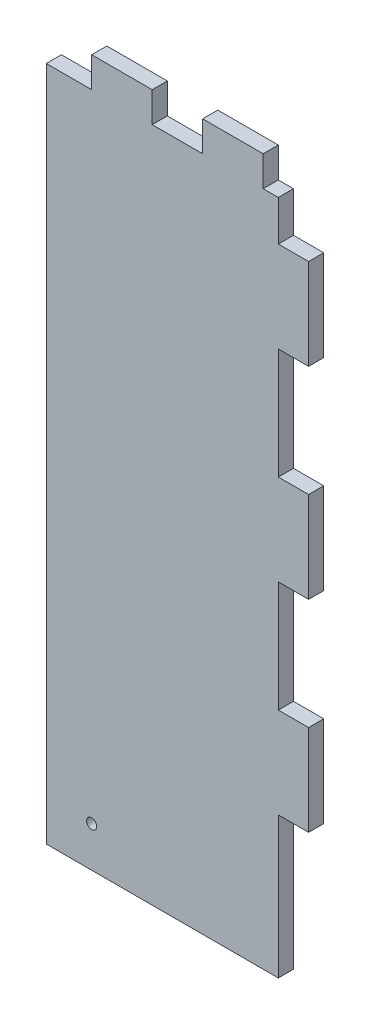
ISO-10303-21;
HEADER;
FILE_DESCRIPTION(('STEP AP214'),'2;1');
FILE_NAME('part.step','',(''),(''),'','','');
FILE_SCHEMA(('AUTOMOTIVE_DESIGN { 1 0 10303 214 1 1 1 1 }'));
ENDSEC;
DATA;
#1=APPLICATION_CONTEXT('core data for automotive mechanical design processes');
#2=APPLICATION_PROTOCOL_DEFINITION('international standard','automotive_design',2000,#1);
#3=PRODUCT_CONTEXT('',#1,'mechanical');
#4=PRODUCT('Part','Part','',(#3));
#5=PRODUCT_RELATED_PRODUCT_CATEGORY('part','',(#4));
#6=PRODUCT_DEFINITION_FORMATION('','',#4);
#7=PRODUCT_DEFINITION_CONTEXT('part definition',#1,'design');
#8=PRODUCT_DEFINITION('design','',#6,#7);
#9=PRODUCT_DEFINITION_SHAPE('','',#8);
#10=(LENGTH_UNIT() NAMED_UNIT(*) SI_UNIT(.MILLI.,.METRE.));
#11=(NAMED_UNIT(*) PLANE_ANGLE_UNIT() SI_UNIT($,.RADIAN.));
#12=(NAMED_UNIT(*) SI_UNIT($,.STERADIAN.) SOLID_ANGLE_UNIT());
#13=UNCERTAINTY_MEASURE_WITH_UNIT(LENGTH_MEASURE(1.E-05),#10,'distance_accuracy_value','');
#14=(GEOMETRIC_REPRESENTATION_CONTEXT(3) GLOBAL_UNCERTAINTY_ASSIGNED_CONTEXT((#13)) GLOBAL_UNIT_ASSIGNED_CONTEXT((#10,
#11,#12)) REPRESENTATION_CONTEXT('',''));
#15=CARTESIAN_POINT('',(0.,0.,0.));
#16=DIRECTION('',(0.,0.,1.));
#17=DIRECTION('',(1.,0.,0.));
#18=AXIS2_PLACEMENT_3D('',#15,#16,#17);
#19=CARTESIAN_POINT('',(46.7532467532468,-43.1168831168831,3.));
#20=DIRECTION('',(-1.,0.,0.));
#21=DIRECTION('',(0.,0.,1.));
#22=AXIS2_PLACEMENT_3D('',#19,#20,#21);
#23=PLANE('',#22);
#24=DIRECTION('',(0.,1.,0.));
#25=VECTOR('',#24,1.);
#26=CARTESIAN_POINT('',(46.7532467532468,-43.1168831168831,0.));
#27=LINE('',#26,#25);
#28=CARTESIAN_POINT('',(46.7532467532468,24.883116599044,0.));
#29=VERTEX_POINT('',#28);
#30=CARTESIAN_POINT('',(46.7532467532468,42.883116599044,0.));
#31=VERTEX_POINT('',#30);
#32=EDGE_CURVE('E378',#29,#31,#27,.T.);
#33=ORIENTED_EDGE('',*,*,#32,.T.);
#34=DIRECTION('',(0.,0.,1.));
#35=VECTOR('',#34,1.);
#36=CARTESIAN_POINT('',(46.7532467532468,42.883116599044,0.));
#37=LINE('',#36,#35);
#38=CARTESIAN_POINT('',(46.7532467532468,42.883116599044,3.));
#39=VERTEX_POINT('',#38);
#40=EDGE_CURVE('E250',#31,#39,#37,.T.);
#41=ORIENTED_EDGE('',*,*,#40,.T.);
#42=DIRECTION('',(0.,1.,0.));
#43=VECTOR('',#42,1.);
#44=CARTESIAN_POINT('',(46.7532467532468,-43.1168831168831,3.));
#45=LINE('',#44,#43);
#46=CARTESIAN_POINT('',(46.7532467532468,24.883116599044,3.));
#47=VERTEX_POINT('',#46);
#48=EDGE_CURVE('E368',#47,#39,#45,.T.);
#49=ORIENTED_EDGE('',*,*,#48,.F.);
#50=DIRECTION('',(0.,0.,1.));
#51=VECTOR('',#50,1.);
#52=CARTESIAN_POINT('',(46.7532467532468,24.883116599044,0.));
#53=LINE('',#52,#51);
#54=EDGE_CURVE('E302',#29,#47,#53,.T.);
#55=ORIENTED_EDGE('',*,*,#54,.F.);
#56=EDGE_LOOP('',(#33,#41,#49,#55));
#57=FACE_BOUND('',#56,.T.);
#58=ADVANCED_FACE('F35',(#57),#23,.F.);
#59=CARTESIAN_POINT('',(46.7532467532468,-15.116883400956,0.));
#60=VERTEX_POINT('',#59);
#61=CARTESIAN_POINT('',(46.7532467532468,2.88311659904397,0.));
#62=VERTEX_POINT('',#61);
#63=EDGE_CURVE('E379',#60,#62,#27,.T.);
#64=ORIENTED_EDGE('',*,*,#63,.T.);
#65=DIRECTION('',(0.,0.,1.));
#66=VECTOR('',#65,1.);
#67=CARTESIAN_POINT('',(46.7532467532468,2.88311659904397,0.));
#68=LINE('',#67,#66);
#69=CARTESIAN_POINT('',(46.7532467532468,2.88311659904397,3.));
#70=VERTEX_POINT('',#69);
#71=EDGE_CURVE('E281',#62,#70,#68,.T.);
#72=ORIENTED_EDGE('',*,*,#71,.T.);
#73=CARTESIAN_POINT('',(46.7532467532468,-15.116883400956,3.));
#74=VERTEX_POINT('',#73);
#75=EDGE_CURVE('E369',#74,#70,#45,.T.);
#76=ORIENTED_EDGE('',*,*,#75,.F.);
#77=DIRECTION('',(0.,0.,1.));
#78=VECTOR('',#77,1.);
#79=CARTESIAN_POINT('',(46.7532467532468,-15.116883400956,0.));
#80=LINE('',#79,#78);
#81=EDGE_CURVE('E325',#60,#74,#80,.T.);
#82=ORIENTED_EDGE('',*,*,#81,.F.);
#83=EDGE_LOOP('',(#64,#72,#76,#82));
#84=FACE_BOUND('',#83,.T.);
#85=ADVANCED_FACE('F408',(#84),#23,.F.);
#86=CARTESIAN_POINT('',(-5.24675324675319,96.8831168831169,3.));
#87=DIRECTION('',(0.,-1.,0.));
#88=DIRECTION('',(0.,0.,-1.));
#89=AXIS2_PLACEMENT_3D('',#86,#87,#88);
#90=PLANE('',#89);
#91=DIRECTION('',(-1.,0.,0.));
#92=VECTOR('',#91,1.);
#93=CARTESIAN_POINT('',(-5.24675324675319,96.8831168831169,3.));
#94=LINE('',#93,#92);
#95=CARTESIAN_POINT('',(15.7532467532466,96.8831168831169,3.));
#96=VERTEX_POINT('',#95);
#97=CARTESIAN_POINT('',(3.75324675324659,96.8831168831169,3.));
#98=VERTEX_POINT('',#97);
#99=EDGE_CURVE('E370',#96,#98,#94,.T.);
#100=ORIENTED_EDGE('',*,*,#99,.F.);
#101=DIRECTION('',(0.,0.,1.));
#102=VECTOR('',#101,1.);
#103=CARTESIAN_POINT('',(15.7532467532466,96.8831168831169,0.));
#104=LINE('',#103,#102);
#105=CARTESIAN_POINT('',(15.7532467532466,96.8831168831169,0.));
#106=VERTEX_POINT('',#105);
#107=EDGE_CURVE('E227',#106,#96,#104,.T.);
#108=ORIENTED_EDGE('',*,*,#107,.F.);
#109=DIRECTION('',(-1.,0.,0.));
#110=VECTOR('',#109,1.);
#111=CARTESIAN_POINT('',(-5.24675324675319,96.8831168831169,0.));
#112=LINE('',#111,#110);
#113=CARTESIAN_POINT('',(3.75324675324659,96.8831168831169,0.));
#114=VERTEX_POINT('',#113);
#115=EDGE_CURVE('E217',#106,#114,#112,.T.);
#116=ORIENTED_EDGE('',*,*,#115,.T.);
#117=DIRECTION('',(0.,0.,1.));
#118=VECTOR('',#117,1.);
#119=CARTESIAN_POINT('',(3.75324675324659,96.8831168831169,0.));
#120=LINE('',#119,#118);
#121=EDGE_CURVE('E352',#114,#98,#120,.T.);
#122=ORIENTED_EDGE('',*,*,#121,.T.);
#123=EDGE_LOOP('',(#100,#108,#116,#122));
#124=FACE_BOUND('',#123,.T.);
#125=ADVANCED_FACE('F433',(#124),#90,.F.);
#126=CARTESIAN_POINT('',(-5.24675324675319,-43.1168831168831,3.));
#127=DIRECTION('',(1.,0.,0.));
#128=DIRECTION('',(0.,0.,-1.));
#129=AXIS2_PLACEMENT_3D('',#126,#127,#128);
#130=PLANE('',#129);
#131=DIRECTION('',(0.,-1.,0.));
#132=VECTOR('',#131,1.);
#133=CARTESIAN_POINT('',(-5.24675324675319,-43.1168831168831,3.));
#134=LINE('',#133,#132);
#135=CARTESIAN_POINT('',(-5.24675324675319,90.8831168831169,3.));
#136=VERTEX_POINT('',#135);
#137=CARTESIAN_POINT('',(-5.24675324675319,-43.1168831168831,3.));
#138=VERTEX_POINT('',#137);
#139=EDGE_CURVE('E359',#136,#138,#134,.T.);
#140=ORIENTED_EDGE('',*,*,#139,.F.);
#141=DIRECTION('',(0.,0.,1.));
#142=VECTOR('',#141,1.);
#143=CARTESIAN_POINT('',(-5.24675324675319,90.8831168831169,0.));
#144=LINE('',#143,#142);
#145=CARTESIAN_POINT('',(-5.24675324675319,90.8831168831169,0.));
#146=VERTEX_POINT('',#145);
#147=EDGE_CURVE('E347',#146,#136,#144,.T.);
#148=ORIENTED_EDGE('',*,*,#147,.F.);
#149=DIRECTION('',(0.,-1.,0.));
#150=VECTOR('',#149,1.);
#151=CARTESIAN_POINT('',(-5.24675324675319,-43.1168831168831,0.));
#152=LINE('',#151,#150);
#153=CARTESIAN_POINT('',(-5.24675324675319,-43.1168831168831,0.));
#154=VERTEX_POINT('',#153);
#155=EDGE_CURVE('E355',#146,#154,#152,.T.);
#156=ORIENTED_EDGE('',*,*,#155,.T.);
#157=DIRECTION('',(0.,0.,-1.));
#158=VECTOR('',#157,1.);
#159=CARTESIAN_POINT('',(-5.24675324675319,-43.1168831168831,3.));
#160=LINE('',#159,#158);
#161=EDGE_CURVE('E11',#138,#154,#160,.T.);
#162=ORIENTED_EDGE('',*,*,#161,.F.);
#163=EDGE_LOOP('',(#140,#148,#156,#162));
#164=FACE_BOUND('',#163,.T.);
#165=ADVANCED_FACE('F37',(#164),#130,.F.);
#166=CARTESIAN_POINT('',(-5.24675324675319,-43.1168831168831,3.));
#167=DIRECTION('',(0.,1.,0.));
#168=DIRECTION('',(0.,0.,1.));
#169=AXIS2_PLACEMENT_3D('',#166,#167,#168);
#170=PLANE('',#169);
#171=DIRECTION('',(1.,0.,0.));
#172=VECTOR('',#171,1.);
#173=CARTESIAN_POINT('',(-5.24675324675319,-43.1168831168831,0.));
#174=LINE('',#173,#172);
#175=CARTESIAN_POINT('',(40.7532467532468,-43.1168831168831,0.));
#176=VERTEX_POINT('',#175);
#177=EDGE_CURVE('E373',#154,#176,#174,.T.);
#178=ORIENTED_EDGE('',*,*,#177,.T.);
#179=DIRECTION('',(0.,0.,1.));
#180=VECTOR('',#179,1.);
#181=CARTESIAN_POINT('',(40.7532467532468,-43.1168831168831,0.));
#182=LINE('',#181,#180);
#183=CARTESIAN_POINT('',(40.7532467532468,-43.1168831168831,3.));
#184=VERTEX_POINT('',#183);
#185=EDGE_CURVE('E307',#176,#184,#182,.T.);
#186=ORIENTED_EDGE('',*,*,#185,.T.);
#187=DIRECTION('',(1.,0.,0.));
#188=VECTOR('',#187,1.);
#189=CARTESIAN_POINT('',(-5.24675324675319,-43.1168831168831,3.));
#190=LINE('',#189,#188);
#191=EDGE_CURVE('E361',#138,#184,#190,.T.);
#192=ORIENTED_EDGE('',*,*,#191,.F.);
#193=ORIENTED_EDGE('',*,*,#161,.T.);
#194=EDGE_LOOP('',(#178,#186,#192,#193));
#195=FACE_BOUND('',#194,.T.);
#196=ADVANCED_FACE('F437',(#195),#170,.F.);
#197=CARTESIAN_POINT('',(46.7532467532468,64.883116599044,0.));
#198=VERTEX_POINT('',#197);
#199=CARTESIAN_POINT('',(46.7532467532468,82.883116599044,0.));
#200=VERTEX_POINT('',#199);
#201=EDGE_CURVE('E376',#198,#200,#27,.T.);
#202=ORIENTED_EDGE('',*,*,#201,.T.);
#203=DIRECTION('',(0.,0.,1.));
#204=VECTOR('',#203,1.);
#205=CARTESIAN_POINT('',(46.7532467532468,82.883116599044,0.));
#206=LINE('',#205,#204);
#207=CARTESIAN_POINT('',(46.7532467532468,82.883116599044,3.));
#208=VERTEX_POINT('',#207);
#209=EDGE_CURVE('E225',#200,#208,#206,.T.);
#210=ORIENTED_EDGE('',*,*,#209,.T.);
#211=CARTESIAN_POINT('',(46.7532467532468,64.883116599044,3.));
#212=VERTEX_POINT('',#211);
#213=EDGE_CURVE('E365',#212,#208,#45,.T.);
#214=ORIENTED_EDGE('',*,*,#213,.F.);
#215=DIRECTION('',(0.,0.,1.));
#216=VECTOR('',#215,1.);
#217=CARTESIAN_POINT('',(46.7532467532468,64.883116599044,0.));
#218=LINE('',#217,#216);
#219=EDGE_CURVE('E276',#198,#212,#218,.T.);
#220=ORIENTED_EDGE('',*,*,#219,.F.);
#221=EDGE_LOOP('',(#202,#210,#214,#220));
#222=FACE_BOUND('',#221,.T.);
#223=ADVANCED_FACE('F429',(#222),#23,.F.);
#224=CARTESIAN_POINT('',(37.7532467532466,96.8831168831169,0.));
#225=VERTEX_POINT('',#224);
#226=CARTESIAN_POINT('',(25.7532467532466,96.8831168831169,0.));
#227=VERTEX_POINT('',#226);
#228=EDGE_CURVE('E362',#225,#227,#112,.T.);
#229=ORIENTED_EDGE('',*,*,#228,.T.);
#230=DIRECTION('',(0.,0.,1.));
#231=VECTOR('',#230,1.);
#232=CARTESIAN_POINT('',(25.7532467532466,96.8831168831169,0.));
#233=LINE('',#232,#231);
#234=CARTESIAN_POINT('',(25.7532467532466,96.8831168831169,3.));
#235=VERTEX_POINT('',#234);
#236=EDGE_CURVE('E230',#227,#235,#233,.T.);
#237=ORIENTED_EDGE('',*,*,#236,.T.);
#238=CARTESIAN_POINT('',(37.7532467532466,96.8831168831169,3.));
#239=VERTEX_POINT('',#238);
#240=EDGE_CURVE('E43',#239,#235,#94,.T.);
#241=ORIENTED_EDGE('',*,*,#240,.F.);
#242=DIRECTION('',(0.,0.,1.));
#243=VECTOR('',#242,1.);
#244=CARTESIAN_POINT('',(37.7532467532466,96.8831168831169,0.));
#245=LINE('',#244,#243);
#246=EDGE_CURVE('E245',#225,#239,#245,.T.);
#247=ORIENTED_EDGE('',*,*,#246,.F.);
#248=EDGE_LOOP('',(#229,#237,#241,#247));
#249=FACE_BOUND('',#248,.T.);
#250=ADVANCED_FACE('F436',(#249),#90,.F.);
#251=CARTESIAN_POINT('',(0.,0.,3.));
#252=DIRECTION('',(0.,0.,-1.));
#253=DIRECTION('',(-1.,0.,0.));
#254=AXIS2_PLACEMENT_3D('',#251,#252,#253);
#255=PLANE('',#254);
#256=CARTESIAN_POINT('',(3.75324675324681,-35.1168831168855,3.));
#257=DIRECTION('',(0.,0.,1.));
#258=DIRECTION('',(1.,0.,0.));
#259=AXIS2_PLACEMENT_3D('',#256,#257,#258);
#260=CIRCLE('',#259,1.);
#261=CARTESIAN_POINT('',(4.75324675324681,-35.1168831168855,3.));
#262=VERTEX_POINT('',#261);
#263=EDGE_CURVE('E338',#262,#262,#260,.T.);
#264=ORIENTED_EDGE('',*,*,#263,.F.);
#265=EDGE_LOOP('',(#264));
#266=FACE_BOUND('',#265,.T.);
#267=DIRECTION('',(1.,0.,0.));
#268=VECTOR('',#267,1.);
#269=CARTESIAN_POINT('',(15.7532467532466,90.8831168831169,3.));
#270=LINE('',#269,#268);
#271=CARTESIAN_POINT('',(15.7532467532466,90.8831168831169,3.));
#272=VERTEX_POINT('',#271);
#273=CARTESIAN_POINT('',(25.7532467532466,90.8831168831169,3.));
#274=VERTEX_POINT('',#273);
#275=EDGE_CURVE('E220',#272,#274,#270,.T.);
#276=ORIENTED_EDGE('',*,*,#275,.F.);
#277=DIRECTION('',(0.,-1.,0.));
#278=VECTOR('',#277,1.);
#279=CARTESIAN_POINT('',(15.7532467532466,96.8831168831169,3.));
#280=LINE('',#279,#278);
#281=EDGE_CURVE('E202',#96,#272,#280,.T.);
#282=ORIENTED_EDGE('',*,*,#281,.F.);
#283=ORIENTED_EDGE('',*,*,#99,.T.);
#284=DIRECTION('',(0.,1.,0.));
#285=VECTOR('',#284,1.);
#286=CARTESIAN_POINT('',(3.75324675324659,96.8831168831169,3.));
#287=LINE('',#286,#285);
#288=CARTESIAN_POINT('',(3.75324675324659,90.8831168831169,3.));
#289=VERTEX_POINT('',#288);
#290=EDGE_CURVE('E345',#289,#98,#287,.T.);
#291=ORIENTED_EDGE('',*,*,#290,.F.);
#292=DIRECTION('',(1.,0.,0.));
#293=VECTOR('',#292,1.);
#294=CARTESIAN_POINT('',(-5.24675324675319,90.8831168831169,3.));
#295=LINE('',#294,#293);
#296=EDGE_CURVE('E229',#136,#289,#295,.T.);
#297=ORIENTED_EDGE('',*,*,#296,.F.);
#298=ORIENTED_EDGE('',*,*,#139,.T.);
#299=ORIENTED_EDGE('',*,*,#191,.T.);
#300=DIRECTION('',(0.,-1.,0.));
#301=VECTOR('',#300,1.);
#302=CARTESIAN_POINT('',(40.7532467532468,-43.1168831168831,3.));
#303=LINE('',#302,#301);
#304=CARTESIAN_POINT('',(40.7532467532468,-15.116883400956,3.));
#305=VERTEX_POINT('',#304);
#306=EDGE_CURVE('E322',#305,#184,#303,.T.);
#307=ORIENTED_EDGE('',*,*,#306,.F.);
#308=DIRECTION('',(-1.,0.,0.));
#309=VECTOR('',#308,1.);
#310=CARTESIAN_POINT('',(46.7532467532468,-15.116883400956,3.));
#311=LINE('',#310,#309);
#312=EDGE_CURVE('E326',#74,#305,#311,.T.);
#313=ORIENTED_EDGE('',*,*,#312,.F.);
#314=ORIENTED_EDGE('',*,*,#75,.T.);
#315=DIRECTION('',(1.,0.,0.));
#316=VECTOR('',#315,1.);
#317=CARTESIAN_POINT('',(46.7532467532468,2.88311659904397,3.));
#318=LINE('',#317,#316);
#319=CARTESIAN_POINT('',(40.7532467532468,2.88311659904397,3.));
#320=VERTEX_POINT('',#319);
#321=EDGE_CURVE('E296',#320,#70,#318,.T.);
#322=ORIENTED_EDGE('',*,*,#321,.F.);
#323=DIRECTION('',(0.,-1.,0.));
#324=VECTOR('',#323,1.);
#325=CARTESIAN_POINT('',(40.7532467532468,2.88311659904397,3.));
#326=LINE('',#325,#324);
#327=CARTESIAN_POINT('',(40.7532467532468,24.883116599044,3.));
#328=VERTEX_POINT('',#327);
#329=EDGE_CURVE('E306',#328,#320,#326,.T.);
#330=ORIENTED_EDGE('',*,*,#329,.F.);
#331=DIRECTION('',(-1.,0.,0.));
#332=VECTOR('',#331,1.);
#333=CARTESIAN_POINT('',(46.7532467532468,24.883116599044,3.));
#334=LINE('',#333,#332);
#335=EDGE_CURVE('E303',#47,#328,#334,.T.);
#336=ORIENTED_EDGE('',*,*,#335,.F.);
#337=ORIENTED_EDGE('',*,*,#48,.T.);
#338=DIRECTION('',(1.,0.,0.));
#339=VECTOR('',#338,1.);
#340=CARTESIAN_POINT('',(46.7532467532468,42.883116599044,3.));
#341=LINE('',#340,#339);
#342=CARTESIAN_POINT('',(40.7532467532468,42.883116599044,3.));
#343=VERTEX_POINT('',#342);
#344=EDGE_CURVE('E270',#343,#39,#341,.T.);
#345=ORIENTED_EDGE('',*,*,#344,.F.);
#346=DIRECTION('',(0.,-1.,0.));
#347=VECTOR('',#346,1.);
#348=CARTESIAN_POINT('',(40.7532467532468,42.883116599044,3.));
#349=LINE('',#348,#347);
#350=CARTESIAN_POINT('',(40.7532467532468,64.883116599044,3.));
#351=VERTEX_POINT('',#350);
#352=EDGE_CURVE('E280',#351,#343,#349,.T.);
#353=ORIENTED_EDGE('',*,*,#352,.F.);
#354=DIRECTION('',(-1.,0.,0.));
#355=VECTOR('',#354,1.);
#356=CARTESIAN_POINT('',(46.7532467532468,64.883116599044,3.));
#357=LINE('',#356,#355);
#358=EDGE_CURVE('E277',#212,#351,#357,.T.);
#359=ORIENTED_EDGE('',*,*,#358,.F.);
#360=ORIENTED_EDGE('',*,*,#213,.T.);
#361=DIRECTION('',(1.,0.,0.));
#362=VECTOR('',#361,1.);
#363=CARTESIAN_POINT('',(40.7532467532468,82.883116599044,3.));
#364=LINE('',#363,#362);
#365=CARTESIAN_POINT('',(40.7532467532468,82.883116599044,3.));
#366=VERTEX_POINT('',#365);
#367=EDGE_CURVE('E237',#366,#208,#364,.T.);
#368=ORIENTED_EDGE('',*,*,#367,.F.);
#369=DIRECTION('',(0.,-1.,0.));
#370=VECTOR('',#369,1.);
#371=CARTESIAN_POINT('',(40.7532467532468,90.8831168831169,3.));
#372=LINE('',#371,#370);
#373=CARTESIAN_POINT('',(40.7532467532468,90.8831168831169,3.));
#374=VERTEX_POINT('',#373);
#375=EDGE_CURVE('E253',#374,#366,#372,.T.);
#376=ORIENTED_EDGE('',*,*,#375,.F.);
#377=DIRECTION('',(1.,0.,0.));
#378=VECTOR('',#377,1.);
#379=CARTESIAN_POINT('',(37.7532467532466,90.8831168831169,3.));
#380=LINE('',#379,#378);
#381=CARTESIAN_POINT('',(37.7532467532466,90.8831168831169,3.));
#382=VERTEX_POINT('',#381);
#383=EDGE_CURVE('E249',#382,#374,#380,.T.);
#384=ORIENTED_EDGE('',*,*,#383,.F.);
#385=DIRECTION('',(0.,-1.,0.));
#386=VECTOR('',#385,1.);
#387=CARTESIAN_POINT('',(37.7532467532466,96.8831168831169,3.));
#388=LINE('',#387,#386);
#389=EDGE_CURVE('E246',#239,#382,#388,.T.);
#390=ORIENTED_EDGE('',*,*,#389,.F.);
#391=ORIENTED_EDGE('',*,*,#240,.T.);
#392=DIRECTION('',(0.,1.,0.));
#393=VECTOR('',#392,1.);
#394=CARTESIAN_POINT('',(25.7532467532466,96.8831168831169,3.));
#395=LINE('',#394,#393);
#396=EDGE_CURVE('E218',#274,#235,#395,.T.);
#397=ORIENTED_EDGE('',*,*,#396,.F.);
#398=EDGE_LOOP('',(#276,#282,#283,#291,#297,#298,#299,#307,#313,#314,#322,#330,#336,#337,#345,
#353,#359,#360,#368,#376,#384,#390,#391,#397));
#399=FACE_BOUND('',#398,.T.);
#400=ADVANCED_FACE('F399',(#266,#399),#255,.F.);
#401=CARTESIAN_POINT('',(0.,0.,0.));
#402=DIRECTION('',(0.,0.,-1.));
#403=DIRECTION('',(-1.,0.,0.));
#404=AXIS2_PLACEMENT_3D('',#401,#402,#403);
#405=PLANE('',#404);
#406=DIRECTION('',(0.,-1.,0.));
#407=VECTOR('',#406,1.);
#408=CARTESIAN_POINT('',(15.7532467532466,96.8831168831169,0.));
#409=LINE('',#408,#407);
#410=CARTESIAN_POINT('',(15.7532467532466,90.8831168831169,0.));
#411=VERTEX_POINT('',#410);
#412=EDGE_CURVE('E199',#106,#411,#409,.T.);
#413=ORIENTED_EDGE('',*,*,#412,.T.);
#414=DIRECTION('',(1.,0.,0.));
#415=VECTOR('',#414,1.);
#416=CARTESIAN_POINT('',(15.7532467532466,90.8831168831169,0.));
#417=LINE('',#416,#415);
#418=CARTESIAN_POINT('',(25.7532467532466,90.8831168831169,0.));
#419=VERTEX_POINT('',#418);
#420=EDGE_CURVE('E209',#411,#419,#417,.T.);
#421=ORIENTED_EDGE('',*,*,#420,.T.);
#422=DIRECTION('',(0.,1.,0.));
#423=VECTOR('',#422,1.);
#424=CARTESIAN_POINT('',(25.7532467532466,96.8831168831169,0.));
#425=LINE('',#424,#423);
#426=EDGE_CURVE('E50',#419,#227,#425,.T.);
#427=ORIENTED_EDGE('',*,*,#426,.T.);
#428=ORIENTED_EDGE('',*,*,#228,.F.);
#429=DIRECTION('',(0.,-1.,0.));
#430=VECTOR('',#429,1.);
#431=CARTESIAN_POINT('',(37.7532467532466,96.8831168831169,0.));
#432=LINE('',#431,#430);
#433=CARTESIAN_POINT('',(37.7532467532466,90.8831168831169,0.));
#434=VERTEX_POINT('',#433);
#435=EDGE_CURVE('E234',#225,#434,#432,.T.);
#436=ORIENTED_EDGE('',*,*,#435,.T.);
#437=DIRECTION('',(1.,0.,0.));
#438=VECTOR('',#437,1.);
#439=CARTESIAN_POINT('',(37.7532467532466,90.8831168831169,0.));
#440=LINE('',#439,#438);
#441=CARTESIAN_POINT('',(40.7532467532468,90.8831168831169,0.));
#442=VERTEX_POINT('',#441);
#443=EDGE_CURVE('E58',#434,#442,#440,.T.);
#444=ORIENTED_EDGE('',*,*,#443,.T.);
#445=DIRECTION('',(0.,-1.,0.));
#446=VECTOR('',#445,1.);
#447=CARTESIAN_POINT('',(40.7532467532468,90.8831168831169,0.));
#448=LINE('',#447,#446);
#449=CARTESIAN_POINT('',(40.7532467532468,82.883116599044,0.));
#450=VERTEX_POINT('',#449);
#451=EDGE_CURVE('E239',#442,#450,#448,.T.);
#452=ORIENTED_EDGE('',*,*,#451,.T.);
#453=DIRECTION('',(1.,0.,0.));
#454=VECTOR('',#453,1.);
#455=CARTESIAN_POINT('',(40.7532467532468,82.883116599044,0.));
#456=LINE('',#455,#454);
#457=EDGE_CURVE('E242',#450,#200,#456,.T.);
#458=ORIENTED_EDGE('',*,*,#457,.T.);
#459=ORIENTED_EDGE('',*,*,#201,.F.);
#460=DIRECTION('',(-1.,0.,0.));
#461=VECTOR('',#460,1.);
#462=CARTESIAN_POINT('',(46.7532467532468,64.883116599044,0.));
#463=LINE('',#462,#461);
#464=CARTESIAN_POINT('',(40.7532467532468,64.883116599044,0.));
#465=VERTEX_POINT('',#464);
#466=EDGE_CURVE('E266',#198,#465,#463,.T.);
#467=ORIENTED_EDGE('',*,*,#466,.T.);
#468=DIRECTION('',(0.,-1.,0.));
#469=VECTOR('',#468,1.);
#470=CARTESIAN_POINT('',(40.7532467532468,42.883116599044,0.));
#471=LINE('',#470,#469);
#472=CARTESIAN_POINT('',(40.7532467532468,42.883116599044,0.));
#473=VERTEX_POINT('',#472);
#474=EDGE_CURVE('E269',#465,#473,#471,.T.);
#475=ORIENTED_EDGE('',*,*,#474,.T.);
#476=DIRECTION('',(1.,0.,0.));
#477=VECTOR('',#476,1.);
#478=CARTESIAN_POINT('',(46.7532467532468,42.883116599044,0.));
#479=LINE('',#478,#477);
#480=EDGE_CURVE('E273',#473,#31,#479,.T.);
#481=ORIENTED_EDGE('',*,*,#480,.T.);
#482=ORIENTED_EDGE('',*,*,#32,.F.);
#483=DIRECTION('',(-1.,0.,0.));
#484=VECTOR('',#483,1.);
#485=CARTESIAN_POINT('',(46.7532467532468,24.883116599044,0.));
#486=LINE('',#485,#484);
#487=CARTESIAN_POINT('',(40.7532467532468,24.883116599044,0.));
#488=VERTEX_POINT('',#487);
#489=EDGE_CURVE('E292',#29,#488,#486,.T.);
#490=ORIENTED_EDGE('',*,*,#489,.T.);
#491=DIRECTION('',(0.,-1.,0.));
#492=VECTOR('',#491,1.);
#493=CARTESIAN_POINT('',(40.7532467532468,2.88311659904397,0.));
#494=LINE('',#493,#492);
#495=CARTESIAN_POINT('',(40.7532467532468,2.88311659904397,0.));
#496=VERTEX_POINT('',#495);
#497=EDGE_CURVE('E295',#488,#496,#494,.T.);
#498=ORIENTED_EDGE('',*,*,#497,.T.);
#499=DIRECTION('',(1.,0.,0.));
#500=VECTOR('',#499,1.);
#501=CARTESIAN_POINT('',(46.7532467532468,2.88311659904397,0.));
#502=LINE('',#501,#500);
#503=EDGE_CURVE('E299',#496,#62,#502,.T.);
#504=ORIENTED_EDGE('',*,*,#503,.T.);
#505=ORIENTED_EDGE('',*,*,#63,.F.);
#506=DIRECTION('',(-1.,0.,0.));
#507=VECTOR('',#506,1.);
#508=CARTESIAN_POINT('',(46.7532467532468,-15.116883400956,0.));
#509=LINE('',#508,#507);
#510=CARTESIAN_POINT('',(40.7532467532468,-15.116883400956,0.));
#511=VERTEX_POINT('',#510);
#512=EDGE_CURVE('E318',#60,#511,#509,.T.);
#513=ORIENTED_EDGE('',*,*,#512,.T.);
#514=DIRECTION('',(0.,-1.,0.));
#515=VECTOR('',#514,1.);
#516=CARTESIAN_POINT('',(40.7532467532468,-43.1168831168831,0.));
#517=LINE('',#516,#515);
#518=EDGE_CURVE('E321',#511,#176,#517,.T.);
#519=ORIENTED_EDGE('',*,*,#518,.T.);
#520=ORIENTED_EDGE('',*,*,#177,.F.);
#521=ORIENTED_EDGE('',*,*,#155,.F.);
#522=DIRECTION('',(1.,0.,0.));
#523=VECTOR('',#522,1.);
#524=CARTESIAN_POINT('',(-5.24675324675319,90.8831168831169,0.));
#525=LINE('',#524,#523);
#526=CARTESIAN_POINT('',(3.75324675324659,90.8831168831169,0.));
#527=VERTEX_POINT('',#526);
#528=EDGE_CURVE('E341',#146,#527,#525,.T.);
#529=ORIENTED_EDGE('',*,*,#528,.T.);
#530=DIRECTION('',(0.,1.,0.));
#531=VECTOR('',#530,1.);
#532=CARTESIAN_POINT('',(3.75324675324659,96.8831168831169,0.));
#533=LINE('',#532,#531);
#534=EDGE_CURVE('E344',#527,#114,#533,.T.);
#535=ORIENTED_EDGE('',*,*,#534,.T.);
#536=ORIENTED_EDGE('',*,*,#115,.F.);
#537=EDGE_LOOP('',(#413,#421,#427,#428,#436,#444,#452,#458,#459,#467,#475,#481,#482,#490,#498,
#504,#505,#513,#519,#520,#521,#529,#535,#536));
#538=FACE_BOUND('',#537,.T.);
#539=CARTESIAN_POINT('',(3.75324675324681,-35.1168831168855,0.));
#540=DIRECTION('',(0.,0.,1.));
#541=DIRECTION('',(1.,0.,0.));
#542=AXIS2_PLACEMENT_3D('',#539,#540,#541);
#543=CIRCLE('',#542,1.);
#544=CARTESIAN_POINT('',(4.75324675324681,-35.1168831168855,0.));
#545=VERTEX_POINT('',#544);
#546=EDGE_CURVE('E329',#545,#545,#543,.T.);
#547=ORIENTED_EDGE('',*,*,#546,.T.);
#548=EDGE_LOOP('',(#547));
#549=FACE_BOUND('',#548,.T.);
#550=ADVANCED_FACE('F214',(#538,#549),#405,.T.);
#551=CARTESIAN_POINT('',(3.75324675324659,96.8831168831169,0.));
#552=DIRECTION('',(1.,0.,0.));
#553=DIRECTION('',(0.,1.,0.));
#554=AXIS2_PLACEMENT_3D('',#551,#552,#553);
#555=PLANE('',#554);
#556=ORIENTED_EDGE('',*,*,#290,.T.);
#557=ORIENTED_EDGE('',*,*,#121,.F.);
#558=ORIENTED_EDGE('',*,*,#534,.F.);
#559=DIRECTION('',(0.,0.,1.));
#560=VECTOR('',#559,1.);
#561=CARTESIAN_POINT('',(3.75324675324659,90.8831168831169,0.));
#562=LINE('',#561,#560);
#563=EDGE_CURVE('E356',#527,#289,#562,.T.);
#564=ORIENTED_EDGE('',*,*,#563,.T.);
#565=EDGE_LOOP('',(#556,#557,#558,#564));
#566=FACE_BOUND('',#565,.T.);
#567=ADVANCED_FACE('F485',(#566),#555,.F.);
#568=CARTESIAN_POINT('',(-5.24675324675319,90.8831168831169,0.));
#569=DIRECTION('',(0.,-1.,0.));
#570=DIRECTION('',(0.,0.,-1.));
#571=AXIS2_PLACEMENT_3D('',#568,#569,#570);
#572=PLANE('',#571);
#573=ORIENTED_EDGE('',*,*,#296,.T.);
#574=ORIENTED_EDGE('',*,*,#563,.F.);
#575=ORIENTED_EDGE('',*,*,#528,.F.);
#576=ORIENTED_EDGE('',*,*,#147,.T.);
#577=EDGE_LOOP('',(#573,#574,#575,#576));
#578=FACE_BOUND('',#577,.T.);
#579=ADVANCED_FACE('F483',(#578),#572,.F.);
#580=CARTESIAN_POINT('',(3.75324675324681,-35.1168831168855,0.));
#581=DIRECTION('',(0.,0.,1.));
#582=DIRECTION('',(1.,0.,0.));
#583=AXIS2_PLACEMENT_3D('',#580,#581,#582);
#584=CYLINDRICAL_SURFACE('',#583,1.);
#585=ORIENTED_EDGE('',*,*,#546,.F.);
#586=EDGE_LOOP('',(#585));
#587=FACE_BOUND('',#586,.T.);
#588=ORIENTED_EDGE('',*,*,#263,.T.);
#589=EDGE_LOOP('',(#588));
#590=FACE_BOUND('',#589,.T.);
#591=ADVANCED_FACE('F478',(#587,#590),#584,.F.);
#592=CARTESIAN_POINT('',(40.7532467532468,-43.1168831168831,0.));
#593=DIRECTION('',(-1.,0.,0.));
#594=DIRECTION('',(0.,0.,1.));
#595=AXIS2_PLACEMENT_3D('',#592,#593,#594);
#596=PLANE('',#595);
#597=ORIENTED_EDGE('',*,*,#306,.T.);
#598=ORIENTED_EDGE('',*,*,#185,.F.);
#599=ORIENTED_EDGE('',*,*,#518,.F.);
#600=DIRECTION('',(0.,0.,1.));
#601=VECTOR('',#600,1.);
#602=CARTESIAN_POINT('',(40.7532467532468,-15.116883400956,0.));
#603=LINE('',#602,#601);
#604=EDGE_CURVE('E333',#511,#305,#603,.T.);
#605=ORIENTED_EDGE('',*,*,#604,.T.);
#606=EDGE_LOOP('',(#597,#598,#599,#605));
#607=FACE_BOUND('',#606,.T.);
#608=ADVANCED_FACE('F472',(#607),#596,.F.);
#609=CARTESIAN_POINT('',(46.7532467532468,-15.116883400956,0.));
#610=DIRECTION('',(0.,1.,0.));
#611=DIRECTION('',(0.,0.,1.));
#612=AXIS2_PLACEMENT_3D('',#609,#610,#611);
#613=PLANE('',#612);
#614=ORIENTED_EDGE('',*,*,#312,.T.);
#615=ORIENTED_EDGE('',*,*,#604,.F.);
#616=ORIENTED_EDGE('',*,*,#512,.F.);
#617=ORIENTED_EDGE('',*,*,#81,.T.);
#618=EDGE_LOOP('',(#614,#615,#616,#617));
#619=FACE_BOUND('',#618,.T.);
#620=ADVANCED_FACE('F468',(#619),#613,.F.);
#621=CARTESIAN_POINT('',(46.7532467532468,2.88311659904397,0.));
#622=DIRECTION('',(0.,-1.,0.));
#623=DIRECTION('',(0.,0.,-1.));
#624=AXIS2_PLACEMENT_3D('',#621,#622,#623);
#625=PLANE('',#624);
#626=ORIENTED_EDGE('',*,*,#321,.T.);
#627=ORIENTED_EDGE('',*,*,#71,.F.);
#628=ORIENTED_EDGE('',*,*,#503,.F.);
#629=DIRECTION('',(0.,0.,1.));
#630=VECTOR('',#629,1.);
#631=CARTESIAN_POINT('',(40.7532467532468,2.88311659904397,0.));
#632=LINE('',#631,#630);
#633=EDGE_CURVE('E313',#496,#320,#632,.T.);
#634=ORIENTED_EDGE('',*,*,#633,.T.);
#635=EDGE_LOOP('',(#626,#627,#628,#634));
#636=FACE_BOUND('',#635,.T.);
#637=ADVANCED_FACE('F411',(#636),#625,.F.);
#638=CARTESIAN_POINT('',(40.7532467532468,2.88311659904397,0.));
#639=DIRECTION('',(-1.,0.,0.));
#640=DIRECTION('',(0.,0.,1.));
#641=AXIS2_PLACEMENT_3D('',#638,#639,#640);
#642=PLANE('',#641);
#643=ORIENTED_EDGE('',*,*,#329,.T.);
#644=ORIENTED_EDGE('',*,*,#633,.F.);
#645=ORIENTED_EDGE('',*,*,#497,.F.);
#646=DIRECTION('',(0.,0.,1.));
#647=VECTOR('',#646,1.);
#648=CARTESIAN_POINT('',(40.7532467532468,24.883116599044,0.));
#649=LINE('',#648,#647);
#650=EDGE_CURVE('E315',#488,#328,#649,.T.);
#651=ORIENTED_EDGE('',*,*,#650,.T.);
#652=EDGE_LOOP('',(#643,#644,#645,#651));
#653=FACE_BOUND('',#652,.T.);
#654=ADVANCED_FACE('F414',(#653),#642,.F.);
#655=CARTESIAN_POINT('',(46.7532467532468,24.883116599044,0.));
#656=DIRECTION('',(0.,1.,0.));
#657=DIRECTION('',(0.,0.,1.));
#658=AXIS2_PLACEMENT_3D('',#655,#656,#657);
#659=PLANE('',#658);
#660=ORIENTED_EDGE('',*,*,#335,.T.);
#661=ORIENTED_EDGE('',*,*,#650,.F.);
#662=ORIENTED_EDGE('',*,*,#489,.F.);
#663=ORIENTED_EDGE('',*,*,#54,.T.);
#664=EDGE_LOOP('',(#660,#661,#662,#663));
#665=FACE_BOUND('',#664,.T.);
#666=ADVANCED_FACE('F416',(#665),#659,.F.);
#667=CARTESIAN_POINT('',(46.7532467532468,42.883116599044,0.));
#668=DIRECTION('',(0.,-1.,0.));
#669=DIRECTION('',(0.,0.,-1.));
#670=AXIS2_PLACEMENT_3D('',#667,#668,#669);
#671=PLANE('',#670);
#672=ORIENTED_EDGE('',*,*,#344,.T.);
#673=ORIENTED_EDGE('',*,*,#40,.F.);
#674=ORIENTED_EDGE('',*,*,#480,.F.);
#675=DIRECTION('',(0.,0.,1.));
#676=VECTOR('',#675,1.);
#677=CARTESIAN_POINT('',(40.7532467532468,42.883116599044,0.));
#678=LINE('',#677,#676);
#679=EDGE_CURVE('E287',#473,#343,#678,.T.);
#680=ORIENTED_EDGE('',*,*,#679,.T.);
#681=EDGE_LOOP('',(#672,#673,#674,#680));
#682=FACE_BOUND('',#681,.T.);
#683=ADVANCED_FACE('F395',(#682),#671,.F.);
#684=CARTESIAN_POINT('',(40.7532467532468,42.883116599044,0.));
#685=DIRECTION('',(-1.,0.,0.));
#686=DIRECTION('',(0.,0.,1.));
#687=AXIS2_PLACEMENT_3D('',#684,#685,#686);
#688=PLANE('',#687);
#689=ORIENTED_EDGE('',*,*,#352,.T.);
#690=ORIENTED_EDGE('',*,*,#679,.F.);
#691=ORIENTED_EDGE('',*,*,#474,.F.);
#692=DIRECTION('',(0.,0.,1.));
#693=VECTOR('',#692,1.);
#694=CARTESIAN_POINT('',(40.7532467532468,64.883116599044,0.));
#695=LINE('',#694,#693);
#696=EDGE_CURVE('E289',#465,#351,#695,.T.);
#697=ORIENTED_EDGE('',*,*,#696,.T.);
#698=EDGE_LOOP('',(#689,#690,#691,#697));
#699=FACE_BOUND('',#698,.T.);
#700=ADVANCED_FACE('F423',(#699),#688,.F.);
#701=CARTESIAN_POINT('',(46.7532467532468,64.883116599044,0.));
#702=DIRECTION('',(0.,1.,0.));
#703=DIRECTION('',(0.,0.,1.));
#704=AXIS2_PLACEMENT_3D('',#701,#702,#703);
#705=PLANE('',#704);
#706=ORIENTED_EDGE('',*,*,#358,.T.);
#707=ORIENTED_EDGE('',*,*,#696,.F.);
#708=ORIENTED_EDGE('',*,*,#466,.F.);
#709=ORIENTED_EDGE('',*,*,#219,.T.);
#710=EDGE_LOOP('',(#706,#707,#708,#709));
#711=FACE_BOUND('',#710,.T.);
#712=ADVANCED_FACE('F457',(#711),#705,.F.);
#713=CARTESIAN_POINT('',(40.7532467532468,82.883116599044,0.));
#714=DIRECTION('',(0.,-1.,0.));
#715=DIRECTION('',(0.,0.,-1.));
#716=AXIS2_PLACEMENT_3D('',#713,#714,#715);
#717=PLANE('',#716);
#718=ORIENTED_EDGE('',*,*,#367,.T.);
#719=ORIENTED_EDGE('',*,*,#209,.F.);
#720=ORIENTED_EDGE('',*,*,#457,.F.);
#721=DIRECTION('',(0.,0.,1.));
#722=VECTOR('',#721,1.);
#723=CARTESIAN_POINT('',(40.7532467532468,82.883116599044,0.));
#724=LINE('',#723,#722);
#725=EDGE_CURVE('E259',#450,#366,#724,.T.);
#726=ORIENTED_EDGE('',*,*,#725,.T.);
#727=EDGE_LOOP('',(#718,#719,#720,#726));
#728=FACE_BOUND('',#727,.T.);
#729=ADVANCED_FACE('F451',(#728),#717,.F.);
#730=CARTESIAN_POINT('',(40.7532467532468,90.8831168831169,0.));
#731=DIRECTION('',(-1.,0.,0.));
#732=DIRECTION('',(0.,-1.,0.));
#733=AXIS2_PLACEMENT_3D('',#730,#731,#732);
#734=PLANE('',#733);
#735=ORIENTED_EDGE('',*,*,#375,.T.);
#736=ORIENTED_EDGE('',*,*,#725,.F.);
#737=ORIENTED_EDGE('',*,*,#451,.F.);
#738=DIRECTION('',(0.,0.,1.));
#739=VECTOR('',#738,1.);
#740=CARTESIAN_POINT('',(40.7532467532468,90.8831168831169,0.));
#741=LINE('',#740,#739);
#742=EDGE_CURVE('E261',#442,#374,#741,.T.);
#743=ORIENTED_EDGE('',*,*,#742,.T.);
#744=EDGE_LOOP('',(#735,#736,#737,#743));
#745=FACE_BOUND('',#744,.T.);
#746=ADVANCED_FACE('F559',(#745),#734,.F.);
#747=CARTESIAN_POINT('',(37.7532467532466,90.8831168831169,0.));
#748=DIRECTION('',(0.,-1.,0.));
#749=DIRECTION('',(0.,0.,-1.));
#750=AXIS2_PLACEMENT_3D('',#747,#748,#749);
#751=PLANE('',#750);
#752=ORIENTED_EDGE('',*,*,#383,.T.);
#753=ORIENTED_EDGE('',*,*,#742,.F.);
#754=ORIENTED_EDGE('',*,*,#443,.F.);
#755=DIRECTION('',(0.,0.,1.));
#756=VECTOR('',#755,1.);
#757=CARTESIAN_POINT('',(37.7532467532466,90.8831168831169,0.));
#758=LINE('',#757,#756);
#759=EDGE_CURVE('E263',#434,#382,#758,.T.);
#760=ORIENTED_EDGE('',*,*,#759,.T.);
#761=EDGE_LOOP('',(#752,#753,#754,#760));
#762=FACE_BOUND('',#761,.T.);
#763=ADVANCED_FACE('F568',(#762),#751,.F.);
#764=CARTESIAN_POINT('',(37.7532467532466,96.8831168831169,0.));
#765=DIRECTION('',(-1.,0.,0.));
#766=DIRECTION('',(0.,0.,1.));
#767=AXIS2_PLACEMENT_3D('',#764,#765,#766);
#768=PLANE('',#767);
#769=ORIENTED_EDGE('',*,*,#389,.T.);
#770=ORIENTED_EDGE('',*,*,#759,.F.);
#771=ORIENTED_EDGE('',*,*,#435,.F.);
#772=ORIENTED_EDGE('',*,*,#246,.T.);
#773=EDGE_LOOP('',(#769,#770,#771,#772));
#774=FACE_BOUND('',#773,.T.);
#775=ADVANCED_FACE('F578',(#774),#768,.F.);
#776=CARTESIAN_POINT('',(15.7532467532466,96.8831168831169,0.));
#777=DIRECTION('',(-1.,0.,0.));
#778=DIRECTION('',(0.,0.,1.));
#779=AXIS2_PLACEMENT_3D('',#776,#777,#778);
#780=PLANE('',#779);
#781=ORIENTED_EDGE('',*,*,#281,.T.);
#782=DIRECTION('',(0.,0.,1.));
#783=VECTOR('',#782,1.);
#784=CARTESIAN_POINT('',(15.7532467532466,90.8831168831169,0.));
#785=LINE('',#784,#783);
#786=EDGE_CURVE('E195',#411,#272,#785,.T.);
#787=ORIENTED_EDGE('',*,*,#786,.F.);
#788=ORIENTED_EDGE('',*,*,#412,.F.);
#789=ORIENTED_EDGE('',*,*,#107,.T.);
#790=EDGE_LOOP('',(#781,#787,#788,#789));
#791=FACE_BOUND('',#790,.T.);
#792=ADVANCED_FACE('F197',(#791),#780,.F.);
#793=CARTESIAN_POINT('',(25.7532467532466,96.8831168831169,0.));
#794=DIRECTION('',(1.,0.,0.));
#795=DIRECTION('',(0.,0.,-1.));
#796=AXIS2_PLACEMENT_3D('',#793,#794,#795);
#797=PLANE('',#796);
#798=ORIENTED_EDGE('',*,*,#396,.T.);
#799=ORIENTED_EDGE('',*,*,#236,.F.);
#800=ORIENTED_EDGE('',*,*,#426,.F.);
#801=DIRECTION('',(0.,0.,1.));
#802=VECTOR('',#801,1.);
#803=CARTESIAN_POINT('',(25.7532467532466,90.8831168831169,0.));
#804=LINE('',#803,#802);
#805=EDGE_CURVE('E206',#419,#274,#804,.T.);
#806=ORIENTED_EDGE('',*,*,#805,.T.);
#807=EDGE_LOOP('',(#798,#799,#800,#806));
#808=FACE_BOUND('',#807,.T.);
#809=ADVANCED_FACE('F595',(#808),#797,.F.);
#810=CARTESIAN_POINT('',(15.7532467532466,90.8831168831169,0.));
#811=DIRECTION('',(0.,-1.,0.));
#812=DIRECTION('',(0.,0.,-1.));
#813=AXIS2_PLACEMENT_3D('',#810,#811,#812);
#814=PLANE('',#813);
#815=ORIENTED_EDGE('',*,*,#275,.T.);
#816=ORIENTED_EDGE('',*,*,#805,.F.);
#817=ORIENTED_EDGE('',*,*,#420,.F.);
#818=ORIENTED_EDGE('',*,*,#786,.T.);
#819=EDGE_LOOP('',(#815,#816,#817,#818));
#820=FACE_BOUND('',#819,.T.);
#821=ADVANCED_FACE('F210',(#820),#814,.F.);
#822=CLOSED_SHELL('',(#58,#85,#125,#165,#196,#223,#250,#400,#550,#567,#579,#591,#608,#620,#637,
#654,#666,#683,#700,#712,#729,#746,#763,#775,#792,#809,#821));
#823=MANIFOLD_SOLID_BREP('B2',#822);
#824=ADVANCED_BREP_SHAPE_REPRESENTATION('',(#18,#823),#14);
#825=SHAPE_DEFINITION_REPRESENTATION(#9,#824);
ENDSEC;
END-ISO-10303-21;
